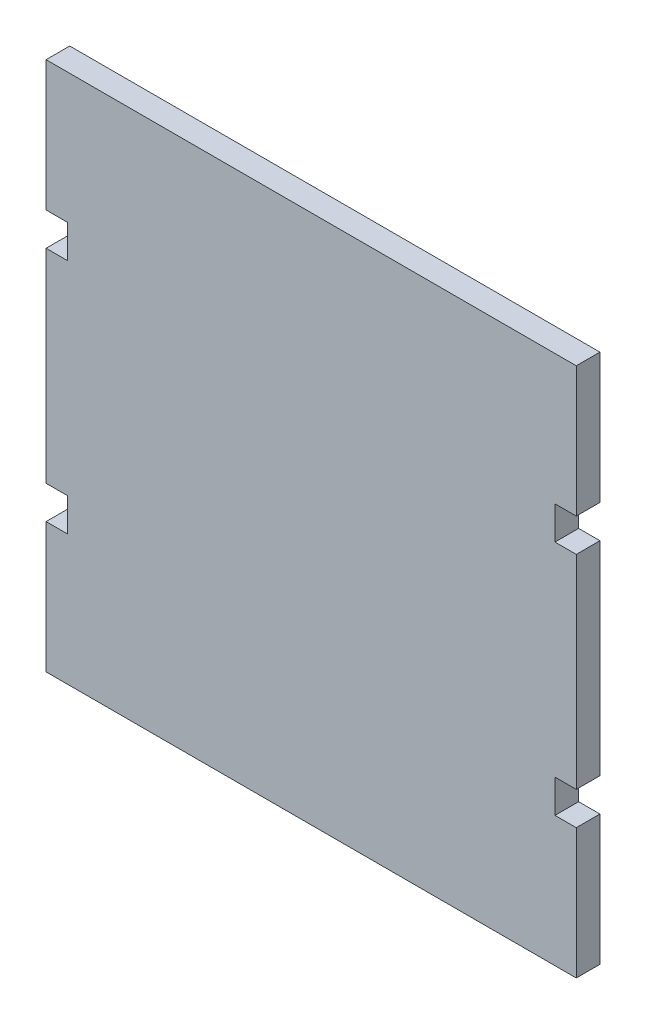
ISO-10303-21;
HEADER;
FILE_DESCRIPTION(('STEP AP214'),'2;1');
FILE_NAME('part.step','',(''),(''),'','','');
FILE_SCHEMA(('AUTOMOTIVE_DESIGN { 1 0 10303 214 1 1 1 1 }'));
ENDSEC;
DATA;
#1=APPLICATION_CONTEXT('core data for automotive mechanical design processes');
#2=APPLICATION_PROTOCOL_DEFINITION('international standard','automotive_design',2000,#1);
#3=PRODUCT_CONTEXT('',#1,'mechanical');
#4=PRODUCT('Part','Part','',(#3));
#5=PRODUCT_RELATED_PRODUCT_CATEGORY('part','',(#4));
#6=PRODUCT_DEFINITION_FORMATION('','',#4);
#7=PRODUCT_DEFINITION_CONTEXT('part definition',#1,'design');
#8=PRODUCT_DEFINITION('design','',#6,#7);
#9=PRODUCT_DEFINITION_SHAPE('','',#8);
#10=(LENGTH_UNIT() NAMED_UNIT(*) SI_UNIT(.MILLI.,.METRE.));
#11=(NAMED_UNIT(*) PLANE_ANGLE_UNIT() SI_UNIT($,.RADIAN.));
#12=(NAMED_UNIT(*) SI_UNIT($,.STERADIAN.) SOLID_ANGLE_UNIT());
#13=UNCERTAINTY_MEASURE_WITH_UNIT(LENGTH_MEASURE(1.E-05),#10,'distance_accuracy_value','');
#14=(GEOMETRIC_REPRESENTATION_CONTEXT(3) GLOBAL_UNCERTAINTY_ASSIGNED_CONTEXT((#13)) GLOBAL_UNIT_ASSIGNED_CONTEXT((#10,
#11,#12)) REPRESENTATION_CONTEXT('',''));
#15=CARTESIAN_POINT('',(0.,0.,0.));
#16=DIRECTION('',(0.,0.,1.));
#17=DIRECTION('',(1.,0.,0.));
#18=AXIS2_PLACEMENT_3D('',#15,#16,#17);
#19=CARTESIAN_POINT('',(-560.,560.,-50.));
#20=DIRECTION('',(-1.,0.,0.));
#21=DIRECTION('',(0.,0.,1.));
#22=AXIS2_PLACEMENT_3D('',#19,#20,#21);
#23=PLANE('',#22);
#24=DIRECTION('',(0.,-1.,0.));
#25=VECTOR('',#24,1.);
#26=CARTESIAN_POINT('',(-560.,560.,0.));
#27=LINE('',#26,#25);
#28=CARTESIAN_POINT('',(-560.,560.,0.));
#29=VERTEX_POINT('',#28);
#30=CARTESIAN_POINT('',(-560.,285.,0.));
#31=VERTEX_POINT('',#30);
#32=EDGE_CURVE('E201',#29,#31,#27,.T.);
#33=ORIENTED_EDGE('',*,*,#32,.F.);
#34=DIRECTION('',(0.,0.,1.));
#35=VECTOR('',#34,1.);
#36=CARTESIAN_POINT('',(-560.,560.,-50.));
#37=LINE('',#36,#35);
#38=CARTESIAN_POINT('',(-560.,560.,-50.));
#39=VERTEX_POINT('',#38);
#40=EDGE_CURVE('E11',#39,#29,#37,.T.);
#41=ORIENTED_EDGE('',*,*,#40,.F.);
#42=DIRECTION('',(0.,-1.,0.));
#43=VECTOR('',#42,1.);
#44=CARTESIAN_POINT('',(-560.,560.,-50.));
#45=LINE('',#44,#43);
#46=CARTESIAN_POINT('',(-560.,285.,-50.));
#47=VERTEX_POINT('',#46);
#48=EDGE_CURVE('E257',#39,#47,#45,.T.);
#49=ORIENTED_EDGE('',*,*,#48,.T.);
#50=DIRECTION('',(0.,0.,1.));
#51=VECTOR('',#50,1.);
#52=CARTESIAN_POINT('',(-560.,285.,-50.));
#53=LINE('',#52,#51);
#54=EDGE_CURVE('E35',#47,#31,#53,.T.);
#55=ORIENTED_EDGE('',*,*,#54,.T.);
#56=EDGE_LOOP('',(#33,#41,#49,#55));
#57=FACE_BOUND('',#56,.T.);
#58=ADVANCED_FACE('F32',(#57),#23,.T.);
#59=CARTESIAN_POINT('',(560.,560.,-50.));
#60=DIRECTION('',(0.,1.,0.));
#61=DIRECTION('',(-1.,0.,0.));
#62=AXIS2_PLACEMENT_3D('',#59,#60,#61);
#63=PLANE('',#62);
#64=DIRECTION('',(-1.,0.,0.));
#65=VECTOR('',#64,1.);
#66=CARTESIAN_POINT('',(560.,560.,0.));
#67=LINE('',#66,#65);
#68=CARTESIAN_POINT('',(560.,560.,0.));
#69=VERTEX_POINT('',#68);
#70=EDGE_CURVE('E255',#69,#29,#67,.T.);
#71=ORIENTED_EDGE('',*,*,#70,.F.);
#72=DIRECTION('',(0.,0.,1.));
#73=VECTOR('',#72,1.);
#74=CARTESIAN_POINT('',(560.,560.,-50.));
#75=LINE('',#74,#73);
#76=CARTESIAN_POINT('',(560.,560.,-50.));
#77=VERTEX_POINT('',#76);
#78=EDGE_CURVE('E41',#77,#69,#75,.T.);
#79=ORIENTED_EDGE('',*,*,#78,.F.);
#80=DIRECTION('',(-1.,0.,0.));
#81=VECTOR('',#80,1.);
#82=CARTESIAN_POINT('',(560.,560.,-50.));
#83=LINE('',#82,#81);
#84=EDGE_CURVE('E191',#77,#39,#83,.T.);
#85=ORIENTED_EDGE('',*,*,#84,.T.);
#86=ORIENTED_EDGE('',*,*,#40,.T.);
#87=EDGE_LOOP('',(#71,#79,#85,#86));
#88=FACE_BOUND('',#87,.T.);
#89=ADVANCED_FACE('F293',(#88),#63,.T.);
#90=CARTESIAN_POINT('',(560.,560.,-50.));
#91=DIRECTION('',(1.,0.,0.));
#92=DIRECTION('',(0.,0.,-1.));
#93=AXIS2_PLACEMENT_3D('',#90,#91,#92);
#94=PLANE('',#93);
#95=DIRECTION('',(0.,1.,0.));
#96=VECTOR('',#95,1.);
#97=CARTESIAN_POINT('',(560.,560.,0.));
#98=LINE('',#97,#96);
#99=CARTESIAN_POINT('',(560.,285.,0.));
#100=VERTEX_POINT('',#99);
#101=EDGE_CURVE('E178',#100,#69,#98,.T.);
#102=ORIENTED_EDGE('',*,*,#101,.F.);
#103=DIRECTION('',(0.,0.,1.));
#104=VECTOR('',#103,1.);
#105=CARTESIAN_POINT('',(560.,285.,-50.));
#106=LINE('',#105,#104);
#107=CARTESIAN_POINT('',(560.,285.,-50.));
#108=VERTEX_POINT('',#107);
#109=EDGE_CURVE('E173',#108,#100,#106,.T.);
#110=ORIENTED_EDGE('',*,*,#109,.F.);
#111=DIRECTION('',(0.,1.,0.));
#112=VECTOR('',#111,1.);
#113=CARTESIAN_POINT('',(560.,560.,-50.));
#114=LINE('',#113,#112);
#115=EDGE_CURVE('E176',#108,#77,#114,.T.);
#116=ORIENTED_EDGE('',*,*,#115,.T.);
#117=ORIENTED_EDGE('',*,*,#78,.T.);
#118=EDGE_LOOP('',(#102,#110,#116,#117));
#119=FACE_BOUND('',#118,.T.);
#120=ADVANCED_FACE('F175',(#119),#94,.T.);
#121=CARTESIAN_POINT('',(560.,285.,-50.));
#122=DIRECTION('',(0.,-1.,0.));
#123=DIRECTION('',(0.,0.,-1.));
#124=AXIS2_PLACEMENT_3D('',#121,#122,#123);
#125=PLANE('',#124);
#126=DIRECTION('',(1.,0.,0.));
#127=VECTOR('',#126,1.);
#128=CARTESIAN_POINT('',(560.,285.,0.));
#129=LINE('',#128,#127);
#130=CARTESIAN_POINT('',(515.,285.,0.));
#131=VERTEX_POINT('',#130);
#132=EDGE_CURVE('E252',#131,#100,#129,.T.);
#133=ORIENTED_EDGE('',*,*,#132,.F.);
#134=DIRECTION('',(0.,0.,1.));
#135=VECTOR('',#134,1.);
#136=CARTESIAN_POINT('',(515.,285.,-50.));
#137=LINE('',#136,#135);
#138=CARTESIAN_POINT('',(515.,285.,-50.));
#139=VERTEX_POINT('',#138);
#140=EDGE_CURVE('E183',#139,#131,#137,.T.);
#141=ORIENTED_EDGE('',*,*,#140,.F.);
#142=DIRECTION('',(1.,0.,0.));
#143=VECTOR('',#142,1.);
#144=CARTESIAN_POINT('',(560.,285.,-50.));
#145=LINE('',#144,#143);
#146=EDGE_CURVE('E189',#139,#108,#145,.T.);
#147=ORIENTED_EDGE('',*,*,#146,.T.);
#148=ORIENTED_EDGE('',*,*,#109,.T.);
#149=EDGE_LOOP('',(#133,#141,#147,#148));
#150=FACE_BOUND('',#149,.T.);
#151=ADVANCED_FACE('F193',(#150),#125,.T.);
#152=CARTESIAN_POINT('',(515.,285.,-50.));
#153=DIRECTION('',(1.,0.,0.));
#154=DIRECTION('',(0.,1.,0.));
#155=AXIS2_PLACEMENT_3D('',#152,#153,#154);
#156=PLANE('',#155);
#157=DIRECTION('',(0.,1.,0.));
#158=VECTOR('',#157,1.);
#159=CARTESIAN_POINT('',(515.,285.,0.));
#160=LINE('',#159,#158);
#161=CARTESIAN_POINT('',(515.,215.,0.));
#162=VERTEX_POINT('',#161);
#163=EDGE_CURVE('E249',#162,#131,#160,.T.);
#164=ORIENTED_EDGE('',*,*,#163,.F.);
#165=DIRECTION('',(0.,0.,1.));
#166=VECTOR('',#165,1.);
#167=CARTESIAN_POINT('',(515.,215.,-50.));
#168=LINE('',#167,#166);
#169=CARTESIAN_POINT('',(515.,215.,-50.));
#170=VERTEX_POINT('',#169);
#171=EDGE_CURVE('E261',#170,#162,#168,.T.);
#172=ORIENTED_EDGE('',*,*,#171,.F.);
#173=DIRECTION('',(0.,1.,0.));
#174=VECTOR('',#173,1.);
#175=CARTESIAN_POINT('',(515.,285.,-50.));
#176=LINE('',#175,#174);
#177=EDGE_CURVE('E194',#170,#139,#176,.T.);
#178=ORIENTED_EDGE('',*,*,#177,.T.);
#179=ORIENTED_EDGE('',*,*,#140,.T.);
#180=EDGE_LOOP('',(#164,#172,#178,#179));
#181=FACE_BOUND('',#180,.T.);
#182=ADVANCED_FACE('F306',(#181),#156,.T.);
#183=CARTESIAN_POINT('',(560.,215.,-50.));
#184=DIRECTION('',(0.,1.,0.));
#185=DIRECTION('',(-1.,0.,0.));
#186=AXIS2_PLACEMENT_3D('',#183,#184,#185);
#187=PLANE('',#186);
#188=DIRECTION('',(-1.,0.,0.));
#189=VECTOR('',#188,1.);
#190=CARTESIAN_POINT('',(560.,215.,0.));
#191=LINE('',#190,#189);
#192=CARTESIAN_POINT('',(560.,215.,0.));
#193=VERTEX_POINT('',#192);
#194=EDGE_CURVE('E246',#193,#162,#191,.T.);
#195=ORIENTED_EDGE('',*,*,#194,.F.);
#196=DIRECTION('',(0.,0.,1.));
#197=VECTOR('',#196,1.);
#198=CARTESIAN_POINT('',(560.,215.,-50.));
#199=LINE('',#198,#197);
#200=CARTESIAN_POINT('',(560.,215.,-50.));
#201=VERTEX_POINT('',#200);
#202=EDGE_CURVE('E263',#201,#193,#199,.T.);
#203=ORIENTED_EDGE('',*,*,#202,.F.);
#204=DIRECTION('',(-1.,0.,0.));
#205=VECTOR('',#204,1.);
#206=CARTESIAN_POINT('',(560.,215.,-50.));
#207=LINE('',#206,#205);
#208=EDGE_CURVE('E196',#201,#170,#207,.T.);
#209=ORIENTED_EDGE('',*,*,#208,.T.);
#210=ORIENTED_EDGE('',*,*,#171,.T.);
#211=EDGE_LOOP('',(#195,#203,#209,#210));
#212=FACE_BOUND('',#211,.T.);
#213=ADVANCED_FACE('F309',(#212),#187,.T.);
#214=CARTESIAN_POINT('',(560.,215.,-50.));
#215=DIRECTION('',(1.,0.,0.));
#216=DIRECTION('',(0.,0.,-1.));
#217=AXIS2_PLACEMENT_3D('',#214,#215,#216);
#218=PLANE('',#217);
#219=DIRECTION('',(0.,1.,0.));
#220=VECTOR('',#219,1.);
#221=CARTESIAN_POINT('',(560.,215.,0.));
#222=LINE('',#221,#220);
#223=CARTESIAN_POINT('',(560.,-215.,0.));
#224=VERTEX_POINT('',#223);
#225=EDGE_CURVE('E243',#224,#193,#222,.T.);
#226=ORIENTED_EDGE('',*,*,#225,.F.);
#227=DIRECTION('',(0.,0.,1.));
#228=VECTOR('',#227,1.);
#229=CARTESIAN_POINT('',(560.,-215.,-50.));
#230=LINE('',#229,#228);
#231=CARTESIAN_POINT('',(560.,-215.,-50.));
#232=VERTEX_POINT('',#231);
#233=EDGE_CURVE('E265',#232,#224,#230,.T.);
#234=ORIENTED_EDGE('',*,*,#233,.F.);
#235=DIRECTION('',(0.,1.,0.));
#236=VECTOR('',#235,1.);
#237=CARTESIAN_POINT('',(560.,215.,-50.));
#238=LINE('',#237,#236);
#239=EDGE_CURVE('E548',#232,#201,#238,.T.);
#240=ORIENTED_EDGE('',*,*,#239,.T.);
#241=ORIENTED_EDGE('',*,*,#202,.T.);
#242=EDGE_LOOP('',(#226,#234,#240,#241));
#243=FACE_BOUND('',#242,.T.);
#244=ADVANCED_FACE('F313',(#243),#218,.T.);
#245=CARTESIAN_POINT('',(560.,-215.,-50.));
#246=DIRECTION('',(0.,-1.,0.));
#247=DIRECTION('',(1.,0.,0.));
#248=AXIS2_PLACEMENT_3D('',#245,#246,#247);
#249=PLANE('',#248);
#250=DIRECTION('',(1.,0.,0.));
#251=VECTOR('',#250,1.);
#252=CARTESIAN_POINT('',(560.,-215.,0.));
#253=LINE('',#252,#251);
#254=CARTESIAN_POINT('',(515.,-215.,0.));
#255=VERTEX_POINT('',#254);
#256=EDGE_CURVE('E240',#255,#224,#253,.T.);
#257=ORIENTED_EDGE('',*,*,#256,.F.);
#258=DIRECTION('',(0.,0.,1.));
#259=VECTOR('',#258,1.);
#260=CARTESIAN_POINT('',(515.,-215.,-50.));
#261=LINE('',#260,#259);
#262=CARTESIAN_POINT('',(515.,-215.,-50.));
#263=VERTEX_POINT('',#262);
#264=EDGE_CURVE('E267',#263,#255,#261,.T.);
#265=ORIENTED_EDGE('',*,*,#264,.F.);
#266=DIRECTION('',(1.,0.,0.));
#267=VECTOR('',#266,1.);
#268=CARTESIAN_POINT('',(560.,-215.,-50.));
#269=LINE('',#268,#267);
#270=EDGE_CURVE('E541',#263,#232,#269,.T.);
#271=ORIENTED_EDGE('',*,*,#270,.T.);
#272=ORIENTED_EDGE('',*,*,#233,.T.);
#273=EDGE_LOOP('',(#257,#265,#271,#272));
#274=FACE_BOUND('',#273,.T.);
#275=ADVANCED_FACE('F317',(#274),#249,.T.);
#276=CARTESIAN_POINT('',(515.,-285.,-50.));
#277=DIRECTION('',(1.,0.,0.));
#278=DIRECTION('',(0.,0.,-1.));
#279=AXIS2_PLACEMENT_3D('',#276,#277,#278);
#280=PLANE('',#279);
#281=DIRECTION('',(0.,1.,0.));
#282=VECTOR('',#281,1.);
#283=CARTESIAN_POINT('',(515.,-285.,0.));
#284=LINE('',#283,#282);
#285=CARTESIAN_POINT('',(515.,-285.,0.));
#286=VERTEX_POINT('',#285);
#287=EDGE_CURVE('E237',#286,#255,#284,.T.);
#288=ORIENTED_EDGE('',*,*,#287,.F.);
#289=DIRECTION('',(0.,0.,1.));
#290=VECTOR('',#289,1.);
#291=CARTESIAN_POINT('',(515.,-285.,-50.));
#292=LINE('',#291,#290);
#293=CARTESIAN_POINT('',(515.,-285.,-50.));
#294=VERTEX_POINT('',#293);
#295=EDGE_CURVE('E269',#294,#286,#292,.T.);
#296=ORIENTED_EDGE('',*,*,#295,.F.);
#297=DIRECTION('',(0.,1.,0.));
#298=VECTOR('',#297,1.);
#299=CARTESIAN_POINT('',(515.,-285.,-50.));
#300=LINE('',#299,#298);
#301=EDGE_CURVE('E537',#294,#263,#300,.T.);
#302=ORIENTED_EDGE('',*,*,#301,.T.);
#303=ORIENTED_EDGE('',*,*,#264,.T.);
#304=EDGE_LOOP('',(#288,#296,#302,#303));
#305=FACE_BOUND('',#304,.T.);
#306=ADVANCED_FACE('F321',(#305),#280,.T.);
#307=CARTESIAN_POINT('',(560.,-285.,-50.));
#308=DIRECTION('',(0.,1.,0.));
#309=DIRECTION('',(-1.,0.,0.));
#310=AXIS2_PLACEMENT_3D('',#307,#308,#309);
#311=PLANE('',#310);
#312=DIRECTION('',(-1.,0.,0.));
#313=VECTOR('',#312,1.);
#314=CARTESIAN_POINT('',(560.,-285.,0.));
#315=LINE('',#314,#313);
#316=CARTESIAN_POINT('',(560.,-285.,0.));
#317=VERTEX_POINT('',#316);
#318=EDGE_CURVE('E234',#317,#286,#315,.T.);
#319=ORIENTED_EDGE('',*,*,#318,.F.);
#320=DIRECTION('',(0.,0.,1.));
#321=VECTOR('',#320,1.);
#322=CARTESIAN_POINT('',(560.,-285.,-50.));
#323=LINE('',#322,#321);
#324=CARTESIAN_POINT('',(560.,-285.,-50.));
#325=VERTEX_POINT('',#324);
#326=EDGE_CURVE('E271',#325,#317,#323,.T.);
#327=ORIENTED_EDGE('',*,*,#326,.F.);
#328=DIRECTION('',(-1.,0.,0.));
#329=VECTOR('',#328,1.);
#330=CARTESIAN_POINT('',(560.,-285.,-50.));
#331=LINE('',#330,#329);
#332=EDGE_CURVE('E553',#325,#294,#331,.T.);
#333=ORIENTED_EDGE('',*,*,#332,.T.);
#334=ORIENTED_EDGE('',*,*,#295,.T.);
#335=EDGE_LOOP('',(#319,#327,#333,#334));
#336=FACE_BOUND('',#335,.T.);
#337=ADVANCED_FACE('F325',(#336),#311,.T.);
#338=CARTESIAN_POINT('',(560.,-285.,-50.));
#339=DIRECTION('',(1.,0.,0.));
#340=DIRECTION('',(0.,0.,-1.));
#341=AXIS2_PLACEMENT_3D('',#338,#339,#340);
#342=PLANE('',#341);
#343=DIRECTION('',(0.,1.,0.));
#344=VECTOR('',#343,1.);
#345=CARTESIAN_POINT('',(560.,-285.,0.));
#346=LINE('',#345,#344);
#347=CARTESIAN_POINT('',(560.,-560.,0.));
#348=VERTEX_POINT('',#347);
#349=EDGE_CURVE('E231',#348,#317,#346,.T.);
#350=ORIENTED_EDGE('',*,*,#349,.F.);
#351=DIRECTION('',(0.,0.,1.));
#352=VECTOR('',#351,1.);
#353=CARTESIAN_POINT('',(560.,-560.,-50.));
#354=LINE('',#353,#352);
#355=CARTESIAN_POINT('',(560.,-560.,-50.));
#356=VERTEX_POINT('',#355);
#357=EDGE_CURVE('E273',#356,#348,#354,.T.);
#358=ORIENTED_EDGE('',*,*,#357,.F.);
#359=DIRECTION('',(0.,1.,0.));
#360=VECTOR('',#359,1.);
#361=CARTESIAN_POINT('',(560.,-285.,-50.));
#362=LINE('',#361,#360);
#363=EDGE_CURVE('E530',#356,#325,#362,.T.);
#364=ORIENTED_EDGE('',*,*,#363,.T.);
#365=ORIENTED_EDGE('',*,*,#326,.T.);
#366=EDGE_LOOP('',(#350,#358,#364,#365));
#367=FACE_BOUND('',#366,.T.);
#368=ADVANCED_FACE('F329',(#367),#342,.T.);
#369=CARTESIAN_POINT('',(560.,-560.,-50.));
#370=DIRECTION('',(0.,-1.,0.));
#371=DIRECTION('',(1.,0.,0.));
#372=AXIS2_PLACEMENT_3D('',#369,#370,#371);
#373=PLANE('',#372);
#374=DIRECTION('',(1.,0.,0.));
#375=VECTOR('',#374,1.);
#376=CARTESIAN_POINT('',(560.,-560.,0.));
#377=LINE('',#376,#375);
#378=CARTESIAN_POINT('',(-560.,-560.,0.));
#379=VERTEX_POINT('',#378);
#380=EDGE_CURVE('E228',#379,#348,#377,.T.);
#381=ORIENTED_EDGE('',*,*,#380,.F.);
#382=DIRECTION('',(0.,0.,1.));
#383=VECTOR('',#382,1.);
#384=CARTESIAN_POINT('',(-560.,-560.,-50.));
#385=LINE('',#384,#383);
#386=CARTESIAN_POINT('',(-560.,-560.,-50.));
#387=VERTEX_POINT('',#386);
#388=EDGE_CURVE('E275',#387,#379,#385,.T.);
#389=ORIENTED_EDGE('',*,*,#388,.F.);
#390=DIRECTION('',(1.,0.,0.));
#391=VECTOR('',#390,1.);
#392=CARTESIAN_POINT('',(560.,-560.,-50.));
#393=LINE('',#392,#391);
#394=EDGE_CURVE('E526',#387,#356,#393,.T.);
#395=ORIENTED_EDGE('',*,*,#394,.T.);
#396=ORIENTED_EDGE('',*,*,#357,.T.);
#397=EDGE_LOOP('',(#381,#389,#395,#396));
#398=FACE_BOUND('',#397,.T.);
#399=ADVANCED_FACE('F333',(#398),#373,.T.);
#400=CARTESIAN_POINT('',(-560.,-285.,-50.));
#401=DIRECTION('',(-1.,0.,0.));
#402=DIRECTION('',(0.,0.,1.));
#403=AXIS2_PLACEMENT_3D('',#400,#401,#402);
#404=PLANE('',#403);
#405=DIRECTION('',(0.,-1.,0.));
#406=VECTOR('',#405,1.);
#407=CARTESIAN_POINT('',(-560.,-285.,0.));
#408=LINE('',#407,#406);
#409=CARTESIAN_POINT('',(-560.,-285.,0.));
#410=VERTEX_POINT('',#409);
#411=EDGE_CURVE('E225',#410,#379,#408,.T.);
#412=ORIENTED_EDGE('',*,*,#411,.F.);
#413=DIRECTION('',(0.,0.,1.));
#414=VECTOR('',#413,1.);
#415=CARTESIAN_POINT('',(-560.,-285.,-50.));
#416=LINE('',#415,#414);
#417=CARTESIAN_POINT('',(-560.,-285.,-50.));
#418=VERTEX_POINT('',#417);
#419=EDGE_CURVE('E277',#418,#410,#416,.T.);
#420=ORIENTED_EDGE('',*,*,#419,.F.);
#421=DIRECTION('',(0.,-1.,0.));
#422=VECTOR('',#421,1.);
#423=CARTESIAN_POINT('',(-560.,-285.,-50.));
#424=LINE('',#423,#422);
#425=EDGE_CURVE('E557',#418,#387,#424,.T.);
#426=ORIENTED_EDGE('',*,*,#425,.T.);
#427=ORIENTED_EDGE('',*,*,#388,.T.);
#428=EDGE_LOOP('',(#412,#420,#426,#427));
#429=FACE_BOUND('',#428,.T.);
#430=ADVANCED_FACE('F337',(#429),#404,.T.);
#431=CARTESIAN_POINT('',(-560.,-285.,-50.));
#432=DIRECTION('',(0.,1.,0.));
#433=DIRECTION('',(0.,0.,1.));
#434=AXIS2_PLACEMENT_3D('',#431,#432,#433);
#435=PLANE('',#434);
#436=DIRECTION('',(-1.,0.,0.));
#437=VECTOR('',#436,1.);
#438=CARTESIAN_POINT('',(-560.,-285.,0.));
#439=LINE('',#438,#437);
#440=CARTESIAN_POINT('',(-515.,-285.,0.));
#441=VERTEX_POINT('',#440);
#442=EDGE_CURVE('E222',#441,#410,#439,.T.);
#443=ORIENTED_EDGE('',*,*,#442,.F.);
#444=DIRECTION('',(0.,0.,1.));
#445=VECTOR('',#444,1.);
#446=CARTESIAN_POINT('',(-515.,-285.,-50.));
#447=LINE('',#446,#445);
#448=CARTESIAN_POINT('',(-515.,-285.,-50.));
#449=VERTEX_POINT('',#448);
#450=EDGE_CURVE('E279',#449,#441,#447,.T.);
#451=ORIENTED_EDGE('',*,*,#450,.F.);
#452=DIRECTION('',(-1.,0.,0.));
#453=VECTOR('',#452,1.);
#454=CARTESIAN_POINT('',(-560.,-285.,-50.));
#455=LINE('',#454,#453);
#456=EDGE_CURVE('E519',#449,#418,#455,.T.);
#457=ORIENTED_EDGE('',*,*,#456,.T.);
#458=ORIENTED_EDGE('',*,*,#419,.T.);
#459=EDGE_LOOP('',(#443,#451,#457,#458));
#460=FACE_BOUND('',#459,.T.);
#461=ADVANCED_FACE('F341',(#460),#435,.T.);
#462=CARTESIAN_POINT('',(-515.,-215.,-50.));
#463=DIRECTION('',(-1.,0.,0.));
#464=DIRECTION('',(0.,0.,1.));
#465=AXIS2_PLACEMENT_3D('',#462,#463,#464);
#466=PLANE('',#465);
#467=DIRECTION('',(0.,-1.,0.));
#468=VECTOR('',#467,1.);
#469=CARTESIAN_POINT('',(-515.,-215.,0.));
#470=LINE('',#469,#468);
#471=CARTESIAN_POINT('',(-515.,-215.,0.));
#472=VERTEX_POINT('',#471);
#473=EDGE_CURVE('E219',#472,#441,#470,.T.);
#474=ORIENTED_EDGE('',*,*,#473,.F.);
#475=DIRECTION('',(0.,0.,1.));
#476=VECTOR('',#475,1.);
#477=CARTESIAN_POINT('',(-515.,-215.,-50.));
#478=LINE('',#477,#476);
#479=CARTESIAN_POINT('',(-515.,-215.,-50.));
#480=VERTEX_POINT('',#479);
#481=EDGE_CURVE('E281',#480,#472,#478,.T.);
#482=ORIENTED_EDGE('',*,*,#481,.F.);
#483=DIRECTION('',(0.,-1.,0.));
#484=VECTOR('',#483,1.);
#485=CARTESIAN_POINT('',(-515.,-215.,-50.));
#486=LINE('',#485,#484);
#487=EDGE_CURVE('E515',#480,#449,#486,.T.);
#488=ORIENTED_EDGE('',*,*,#487,.T.);
#489=ORIENTED_EDGE('',*,*,#450,.T.);
#490=EDGE_LOOP('',(#474,#482,#488,#489));
#491=FACE_BOUND('',#490,.T.);
#492=ADVANCED_FACE('F345',(#491),#466,.T.);
#493=CARTESIAN_POINT('',(-560.,-215.,-50.));
#494=DIRECTION('',(0.,-1.,0.));
#495=DIRECTION('',(0.,0.,-1.));
#496=AXIS2_PLACEMENT_3D('',#493,#494,#495);
#497=PLANE('',#496);
#498=DIRECTION('',(1.,0.,0.));
#499=VECTOR('',#498,1.);
#500=CARTESIAN_POINT('',(-560.,-215.,0.));
#501=LINE('',#500,#499);
#502=CARTESIAN_POINT('',(-560.,-215.,0.));
#503=VERTEX_POINT('',#502);
#504=EDGE_CURVE('E216',#503,#472,#501,.T.);
#505=ORIENTED_EDGE('',*,*,#504,.F.);
#506=DIRECTION('',(0.,0.,1.));
#507=VECTOR('',#506,1.);
#508=CARTESIAN_POINT('',(-560.,-215.,-50.));
#509=LINE('',#508,#507);
#510=CARTESIAN_POINT('',(-560.,-215.,-50.));
#511=VERTEX_POINT('',#510);
#512=EDGE_CURVE('E283',#511,#503,#509,.T.);
#513=ORIENTED_EDGE('',*,*,#512,.F.);
#514=DIRECTION('',(1.,0.,0.));
#515=VECTOR('',#514,1.);
#516=CARTESIAN_POINT('',(-560.,-215.,-50.));
#517=LINE('',#516,#515);
#518=EDGE_CURVE('E561',#511,#480,#517,.T.);
#519=ORIENTED_EDGE('',*,*,#518,.T.);
#520=ORIENTED_EDGE('',*,*,#481,.T.);
#521=EDGE_LOOP('',(#505,#513,#519,#520));
#522=FACE_BOUND('',#521,.T.);
#523=ADVANCED_FACE('F349',(#522),#497,.T.);
#524=CARTESIAN_POINT('',(-560.,215.,-50.));
#525=DIRECTION('',(-1.,0.,0.));
#526=DIRECTION('',(0.,0.,1.));
#527=AXIS2_PLACEMENT_3D('',#524,#525,#526);
#528=PLANE('',#527);
#529=DIRECTION('',(0.,-1.,0.));
#530=VECTOR('',#529,1.);
#531=CARTESIAN_POINT('',(-560.,215.,0.));
#532=LINE('',#531,#530);
#533=CARTESIAN_POINT('',(-560.,215.,0.));
#534=VERTEX_POINT('',#533);
#535=EDGE_CURVE('E213',#534,#503,#532,.T.);
#536=ORIENTED_EDGE('',*,*,#535,.F.);
#537=DIRECTION('',(0.,0.,1.));
#538=VECTOR('',#537,1.);
#539=CARTESIAN_POINT('',(-560.,215.,-50.));
#540=LINE('',#539,#538);
#541=CARTESIAN_POINT('',(-560.,215.,-50.));
#542=VERTEX_POINT('',#541);
#543=EDGE_CURVE('E285',#542,#534,#540,.T.);
#544=ORIENTED_EDGE('',*,*,#543,.F.);
#545=DIRECTION('',(0.,-1.,0.));
#546=VECTOR('',#545,1.);
#547=CARTESIAN_POINT('',(-560.,215.,-50.));
#548=LINE('',#547,#546);
#549=EDGE_CURVE('E508',#542,#511,#548,.T.);
#550=ORIENTED_EDGE('',*,*,#549,.T.);
#551=ORIENTED_EDGE('',*,*,#512,.T.);
#552=EDGE_LOOP('',(#536,#544,#550,#551));
#553=FACE_BOUND('',#552,.T.);
#554=ADVANCED_FACE('F353',(#553),#528,.T.);
#555=CARTESIAN_POINT('',(-560.,215.,-50.));
#556=DIRECTION('',(0.,1.,0.));
#557=DIRECTION('',(0.,0.,1.));
#558=AXIS2_PLACEMENT_3D('',#555,#556,#557);
#559=PLANE('',#558);
#560=DIRECTION('',(-1.,0.,0.));
#561=VECTOR('',#560,1.);
#562=CARTESIAN_POINT('',(-560.,215.,0.));
#563=LINE('',#562,#561);
#564=CARTESIAN_POINT('',(-515.,215.,0.));
#565=VERTEX_POINT('',#564);
#566=EDGE_CURVE('E210',#565,#534,#563,.T.);
#567=ORIENTED_EDGE('',*,*,#566,.F.);
#568=DIRECTION('',(0.,0.,1.));
#569=VECTOR('',#568,1.);
#570=CARTESIAN_POINT('',(-515.,215.,-50.));
#571=LINE('',#570,#569);
#572=CARTESIAN_POINT('',(-515.,215.,-50.));
#573=VERTEX_POINT('',#572);
#574=EDGE_CURVE('E287',#573,#565,#571,.T.);
#575=ORIENTED_EDGE('',*,*,#574,.F.);
#576=DIRECTION('',(-1.,0.,0.));
#577=VECTOR('',#576,1.);
#578=CARTESIAN_POINT('',(-560.,215.,-50.));
#579=LINE('',#578,#577);
#580=EDGE_CURVE('E504',#573,#542,#579,.T.);
#581=ORIENTED_EDGE('',*,*,#580,.T.);
#582=ORIENTED_EDGE('',*,*,#543,.T.);
#583=EDGE_LOOP('',(#567,#575,#581,#582));
#584=FACE_BOUND('',#583,.T.);
#585=ADVANCED_FACE('F357',(#584),#559,.T.);
#586=CARTESIAN_POINT('',(-515.,285.,-50.));
#587=DIRECTION('',(-1.,0.,0.));
#588=DIRECTION('',(0.,0.,1.));
#589=AXIS2_PLACEMENT_3D('',#586,#587,#588);
#590=PLANE('',#589);
#591=DIRECTION('',(0.,-1.,0.));
#592=VECTOR('',#591,1.);
#593=CARTESIAN_POINT('',(-515.,285.,0.));
#594=LINE('',#593,#592);
#595=CARTESIAN_POINT('',(-515.,285.,0.));
#596=VERTEX_POINT('',#595);
#597=EDGE_CURVE('E207',#596,#565,#594,.T.);
#598=ORIENTED_EDGE('',*,*,#597,.F.);
#599=DIRECTION('',(0.,0.,1.));
#600=VECTOR('',#599,1.);
#601=CARTESIAN_POINT('',(-515.,285.,-50.));
#602=LINE('',#601,#600);
#603=CARTESIAN_POINT('',(-515.,285.,-50.));
#604=VERTEX_POINT('',#603);
#605=EDGE_CURVE('E288',#604,#596,#602,.T.);
#606=ORIENTED_EDGE('',*,*,#605,.F.);
#607=DIRECTION('',(0.,-1.,0.));
#608=VECTOR('',#607,1.);
#609=CARTESIAN_POINT('',(-515.,285.,-50.));
#610=LINE('',#609,#608);
#611=EDGE_CURVE('E565',#604,#573,#610,.T.);
#612=ORIENTED_EDGE('',*,*,#611,.T.);
#613=ORIENTED_EDGE('',*,*,#574,.T.);
#614=EDGE_LOOP('',(#598,#606,#612,#613));
#615=FACE_BOUND('',#614,.T.);
#616=ADVANCED_FACE('F361',(#615),#590,.T.);
#617=CARTESIAN_POINT('',(-560.,285.,-50.));
#618=DIRECTION('',(0.,-1.,0.));
#619=DIRECTION('',(0.,0.,-1.));
#620=AXIS2_PLACEMENT_3D('',#617,#618,#619);
#621=PLANE('',#620);
#622=DIRECTION('',(1.,0.,0.));
#623=VECTOR('',#622,1.);
#624=CARTESIAN_POINT('',(-560.,285.,0.));
#625=LINE('',#624,#623);
#626=EDGE_CURVE('E204',#31,#596,#625,.T.);
#627=ORIENTED_EDGE('',*,*,#626,.F.);
#628=ORIENTED_EDGE('',*,*,#54,.F.);
#629=DIRECTION('',(1.,0.,0.));
#630=VECTOR('',#629,1.);
#631=CARTESIAN_POINT('',(-560.,285.,-50.));
#632=LINE('',#631,#630);
#633=EDGE_CURVE('E567',#47,#604,#632,.T.);
#634=ORIENTED_EDGE('',*,*,#633,.T.);
#635=ORIENTED_EDGE('',*,*,#605,.T.);
#636=EDGE_LOOP('',(#627,#628,#634,#635));
#637=FACE_BOUND('',#636,.T.);
#638=ADVANCED_FACE('F290',(#637),#621,.T.);
#639=CARTESIAN_POINT('',(0.,0.,-50.));
#640=DIRECTION('',(0.,0.,1.));
#641=DIRECTION('',(1.,0.,0.));
#642=AXIS2_PLACEMENT_3D('',#639,#640,#641);
#643=PLANE('',#642);
#644=ORIENTED_EDGE('',*,*,#48,.F.);
#645=ORIENTED_EDGE('',*,*,#84,.F.);
#646=ORIENTED_EDGE('',*,*,#115,.F.);
#647=ORIENTED_EDGE('',*,*,#146,.F.);
#648=ORIENTED_EDGE('',*,*,#177,.F.);
#649=ORIENTED_EDGE('',*,*,#208,.F.);
#650=ORIENTED_EDGE('',*,*,#239,.F.);
#651=ORIENTED_EDGE('',*,*,#270,.F.);
#652=ORIENTED_EDGE('',*,*,#301,.F.);
#653=ORIENTED_EDGE('',*,*,#332,.F.);
#654=ORIENTED_EDGE('',*,*,#363,.F.);
#655=ORIENTED_EDGE('',*,*,#394,.F.);
#656=ORIENTED_EDGE('',*,*,#425,.F.);
#657=ORIENTED_EDGE('',*,*,#456,.F.);
#658=ORIENTED_EDGE('',*,*,#487,.F.);
#659=ORIENTED_EDGE('',*,*,#518,.F.);
#660=ORIENTED_EDGE('',*,*,#549,.F.);
#661=ORIENTED_EDGE('',*,*,#580,.F.);
#662=ORIENTED_EDGE('',*,*,#611,.F.);
#663=ORIENTED_EDGE('',*,*,#633,.F.);
#664=EDGE_LOOP('',(#644,#645,#646,#647,#648,#649,#650,#651,#652,#653,#654,#655,#656,#657,#658,
#659,#660,#661,#662,#663));
#665=FACE_BOUND('',#664,.T.);
#666=ADVANCED_FACE('F187',(#665),#643,.F.);
#667=CARTESIAN_POINT('',(0.,0.,0.));
#668=DIRECTION('',(0.,0.,1.));
#669=DIRECTION('',(1.,0.,0.));
#670=AXIS2_PLACEMENT_3D('',#667,#668,#669);
#671=PLANE('',#670);
#672=ORIENTED_EDGE('',*,*,#32,.T.);
#673=ORIENTED_EDGE('',*,*,#626,.T.);
#674=ORIENTED_EDGE('',*,*,#597,.T.);
#675=ORIENTED_EDGE('',*,*,#566,.T.);
#676=ORIENTED_EDGE('',*,*,#535,.T.);
#677=ORIENTED_EDGE('',*,*,#504,.T.);
#678=ORIENTED_EDGE('',*,*,#473,.T.);
#679=ORIENTED_EDGE('',*,*,#442,.T.);
#680=ORIENTED_EDGE('',*,*,#411,.T.);
#681=ORIENTED_EDGE('',*,*,#380,.T.);
#682=ORIENTED_EDGE('',*,*,#349,.T.);
#683=ORIENTED_EDGE('',*,*,#318,.T.);
#684=ORIENTED_EDGE('',*,*,#287,.T.);
#685=ORIENTED_EDGE('',*,*,#256,.T.);
#686=ORIENTED_EDGE('',*,*,#225,.T.);
#687=ORIENTED_EDGE('',*,*,#194,.T.);
#688=ORIENTED_EDGE('',*,*,#163,.T.);
#689=ORIENTED_EDGE('',*,*,#132,.T.);
#690=ORIENTED_EDGE('',*,*,#101,.T.);
#691=ORIENTED_EDGE('',*,*,#70,.T.);
#692=EDGE_LOOP('',(#672,#673,#674,#675,#676,#677,#678,#679,#680,#681,#682,#683,#684,#685,#686,
#687,#688,#689,#690,#691));
#693=FACE_BOUND('',#692,.T.);
#694=ADVANCED_FACE('F292',(#693),#671,.T.);
#695=CLOSED_SHELL('',(#58,#89,#120,#151,#182,#213,#244,#275,#306,#337,#368,#399,#430,#461,#492,
#523,#554,#585,#616,#638,#666,#694));
#696=MANIFOLD_SOLID_BREP('B2',#695);
#697=ADVANCED_BREP_SHAPE_REPRESENTATION('',(#18,#696),#14);
#698=SHAPE_DEFINITION_REPRESENTATION(#9,#697);
ENDSEC;
END-ISO-10303-21;
